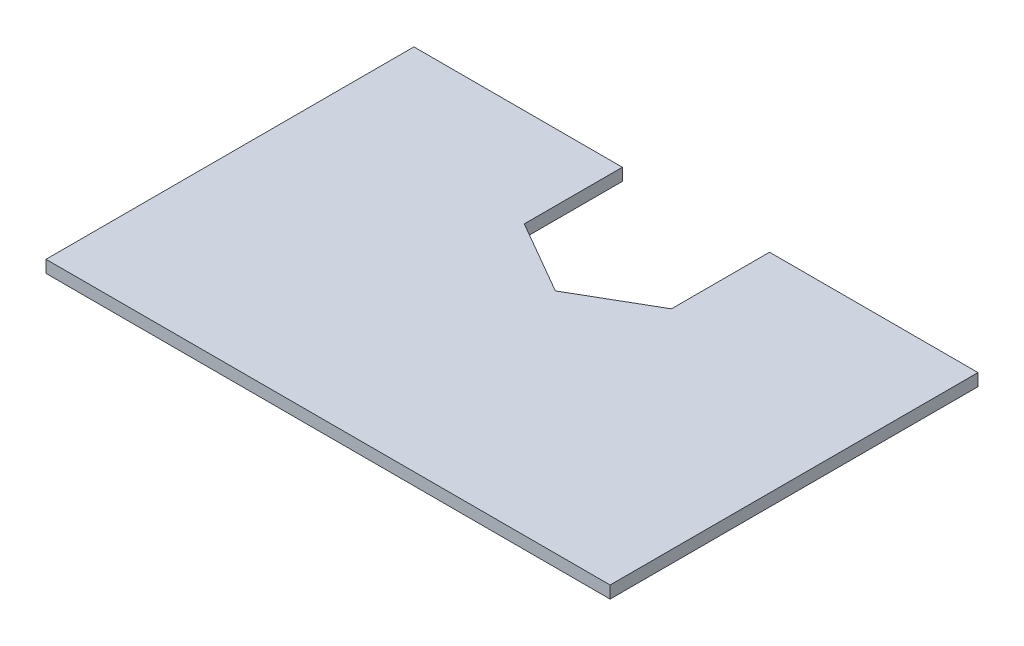
ISO-10303-21;
HEADER;
FILE_DESCRIPTION(('STEP AP214'),'2;1');
FILE_NAME('part.step','',(''),(''),'','','');
FILE_SCHEMA(('AUTOMOTIVE_DESIGN { 1 0 10303 214 1 1 1 1 }'));
ENDSEC;
DATA;
#1=APPLICATION_CONTEXT('core data for automotive mechanical design processes');
#2=APPLICATION_PROTOCOL_DEFINITION('international standard','automotive_design',2000,#1);
#3=PRODUCT_CONTEXT('',#1,'mechanical');
#4=PRODUCT('Part','Part','',(#3));
#5=PRODUCT_RELATED_PRODUCT_CATEGORY('part','',(#4));
#6=PRODUCT_DEFINITION_FORMATION('','',#4);
#7=PRODUCT_DEFINITION_CONTEXT('part definition',#1,'design');
#8=PRODUCT_DEFINITION('design','',#6,#7);
#9=PRODUCT_DEFINITION_SHAPE('','',#8);
#10=(LENGTH_UNIT() NAMED_UNIT(*) SI_UNIT(.MILLI.,.METRE.));
#11=(NAMED_UNIT(*) PLANE_ANGLE_UNIT() SI_UNIT($,.RADIAN.));
#12=(NAMED_UNIT(*) SI_UNIT($,.STERADIAN.) SOLID_ANGLE_UNIT());
#13=UNCERTAINTY_MEASURE_WITH_UNIT(LENGTH_MEASURE(1.E-05),#10,'distance_accuracy_value','');
#14=(GEOMETRIC_REPRESENTATION_CONTEXT(3) GLOBAL_UNCERTAINTY_ASSIGNED_CONTEXT((#13)) GLOBAL_UNIT_ASSIGNED_CONTEXT((#10,
#11,#12)) REPRESENTATION_CONTEXT('',''));
#15=CARTESIAN_POINT('',(0.,0.,0.));
#16=DIRECTION('',(0.,0.,1.));
#17=DIRECTION('',(1.,0.,0.));
#18=AXIS2_PLACEMENT_3D('',#15,#16,#17);
#19=CARTESIAN_POINT('',(0.,5.,0.));
#20=DIRECTION('',(0.,0.,1.));
#21=DIRECTION('',(1.,0.,0.));
#22=AXIS2_PLACEMENT_3D('',#19,#20,#21);
#23=PLANE('',#22);
#24=DIRECTION('',(-1.,0.,0.));
#25=VECTOR('',#24,1.);
#26=CARTESIAN_POINT('',(0.,5.,0.));
#27=LINE('',#26,#25);
#28=CARTESIAN_POINT('',(85.,5.,0.));
#29=VERTEX_POINT('',#28);
#30=CARTESIAN_POINT('',(0.,5.,0.));
#31=VERTEX_POINT('',#30);
#32=EDGE_CURVE('E60',#29,#31,#27,.T.);
#33=ORIENTED_EDGE('',*,*,#32,.F.);
#34=DIRECTION('',(0.,1.,0.));
#35=VECTOR('',#34,1.);
#36=CARTESIAN_POINT('',(85.,0.,0.));
#37=LINE('',#36,#35);
#38=CARTESIAN_POINT('',(85.,0.,0.));
#39=VERTEX_POINT('',#38);
#40=EDGE_CURVE('E148',#39,#29,#37,.T.);
#41=ORIENTED_EDGE('',*,*,#40,.F.);
#42=DIRECTION('',(-1.,0.,0.));
#43=VECTOR('',#42,1.);
#44=CARTESIAN_POINT('',(0.,0.,0.));
#45=LINE('',#44,#43);
#46=CARTESIAN_POINT('',(0.,0.,0.));
#47=VERTEX_POINT('',#46);
#48=EDGE_CURVE('E82',#39,#47,#45,.T.);
#49=ORIENTED_EDGE('',*,*,#48,.T.);
#50=DIRECTION('',(0.,-1.,0.));
#51=VECTOR('',#50,1.);
#52=CARTESIAN_POINT('',(0.,5.,0.));
#53=LINE('',#52,#51);
#54=EDGE_CURVE('E166',#31,#47,#53,.T.);
#55=ORIENTED_EDGE('',*,*,#54,.F.);
#56=EDGE_LOOP('',(#33,#41,#49,#55));
#57=FACE_BOUND('',#56,.T.);
#58=ADVANCED_FACE('F36',(#57),#23,.F.);
#59=CARTESIAN_POINT('',(0.,5.,150.));
#60=DIRECTION('',(1.,0.,0.));
#61=DIRECTION('',(0.,0.,-1.));
#62=AXIS2_PLACEMENT_3D('',#59,#60,#61);
#63=PLANE('',#62);
#64=DIRECTION('',(0.,0.,1.));
#65=VECTOR('',#64,1.);
#66=CARTESIAN_POINT('',(0.,0.,150.));
#67=LINE('',#66,#65);
#68=CARTESIAN_POINT('',(0.,0.,150.));
#69=VERTEX_POINT('',#68);
#70=EDGE_CURVE('E150',#47,#69,#67,.T.);
#71=ORIENTED_EDGE('',*,*,#70,.T.);
#72=DIRECTION('',(0.,-1.,0.));
#73=VECTOR('',#72,1.);
#74=CARTESIAN_POINT('',(0.,5.,150.));
#75=LINE('',#74,#73);
#76=CARTESIAN_POINT('',(0.,5.,150.));
#77=VERTEX_POINT('',#76);
#78=EDGE_CURVE('E11',#77,#69,#75,.T.);
#79=ORIENTED_EDGE('',*,*,#78,.F.);
#80=DIRECTION('',(0.,0.,1.));
#81=VECTOR('',#80,1.);
#82=CARTESIAN_POINT('',(0.,5.,150.));
#83=LINE('',#82,#81);
#84=EDGE_CURVE('E157',#31,#77,#83,.T.);
#85=ORIENTED_EDGE('',*,*,#84,.F.);
#86=ORIENTED_EDGE('',*,*,#54,.T.);
#87=EDGE_LOOP('',(#71,#79,#85,#86));
#88=FACE_BOUND('',#87,.T.);
#89=ADVANCED_FACE('F38',(#88),#63,.F.);
#90=CARTESIAN_POINT('',(230.,5.,150.));
#91=DIRECTION('',(0.,0.,-1.));
#92=DIRECTION('',(-1.,0.,0.));
#93=AXIS2_PLACEMENT_3D('',#90,#91,#92);
#94=PLANE('',#93);
#95=DIRECTION('',(1.,0.,0.));
#96=VECTOR('',#95,1.);
#97=CARTESIAN_POINT('',(230.,0.,150.));
#98=LINE('',#97,#96);
#99=CARTESIAN_POINT('',(230.,0.,150.));
#100=VERTEX_POINT('',#99);
#101=EDGE_CURVE('E169',#69,#100,#98,.T.);
#102=ORIENTED_EDGE('',*,*,#101,.T.);
#103=DIRECTION('',(0.,-1.,0.));
#104=VECTOR('',#103,1.);
#105=CARTESIAN_POINT('',(230.,5.,150.));
#106=LINE('',#105,#104);
#107=CARTESIAN_POINT('',(230.,5.,150.));
#108=VERTEX_POINT('',#107);
#109=EDGE_CURVE('E44',#108,#100,#106,.T.);
#110=ORIENTED_EDGE('',*,*,#109,.F.);
#111=DIRECTION('',(1.,0.,0.));
#112=VECTOR('',#111,1.);
#113=CARTESIAN_POINT('',(230.,5.,150.));
#114=LINE('',#113,#112);
#115=EDGE_CURVE('E89',#77,#108,#114,.T.);
#116=ORIENTED_EDGE('',*,*,#115,.F.);
#117=ORIENTED_EDGE('',*,*,#78,.T.);
#118=EDGE_LOOP('',(#102,#110,#116,#117));
#119=FACE_BOUND('',#118,.T.);
#120=ADVANCED_FACE('F195',(#119),#94,.F.);
#121=CARTESIAN_POINT('',(230.,5.,0.));
#122=DIRECTION('',(-1.,0.,0.));
#123=DIRECTION('',(0.,0.,1.));
#124=AXIS2_PLACEMENT_3D('',#121,#122,#123);
#125=PLANE('',#124);
#126=DIRECTION('',(0.,0.,-1.));
#127=VECTOR('',#126,1.);
#128=CARTESIAN_POINT('',(230.,0.,0.));
#129=LINE('',#128,#127);
#130=CARTESIAN_POINT('',(230.,0.,0.));
#131=VERTEX_POINT('',#130);
#132=EDGE_CURVE('E171',#100,#131,#129,.T.);
#133=ORIENTED_EDGE('',*,*,#132,.T.);
#134=DIRECTION('',(0.,-1.,0.));
#135=VECTOR('',#134,1.);
#136=CARTESIAN_POINT('',(230.,5.,0.));
#137=LINE('',#136,#135);
#138=CARTESIAN_POINT('',(230.,5.,0.));
#139=VERTEX_POINT('',#138);
#140=EDGE_CURVE('E176',#139,#131,#137,.T.);
#141=ORIENTED_EDGE('',*,*,#140,.F.);
#142=DIRECTION('',(0.,0.,-1.));
#143=VECTOR('',#142,1.);
#144=CARTESIAN_POINT('',(230.,5.,0.));
#145=LINE('',#144,#143);
#146=EDGE_CURVE('E161',#108,#139,#145,.T.);
#147=ORIENTED_EDGE('',*,*,#146,.F.);
#148=ORIENTED_EDGE('',*,*,#109,.T.);
#149=EDGE_LOOP('',(#133,#141,#147,#148));
#150=FACE_BOUND('',#149,.T.);
#151=ADVANCED_FACE('F182',(#150),#125,.F.);
#152=CARTESIAN_POINT('',(145.,0.,0.));
#153=VERTEX_POINT('',#152);
#154=EDGE_CURVE('E159',#131,#153,#45,.T.);
#155=ORIENTED_EDGE('',*,*,#154,.T.);
#156=DIRECTION('',(0.,1.,0.));
#157=VECTOR('',#156,1.);
#158=CARTESIAN_POINT('',(145.,0.,0.));
#159=LINE('',#158,#157);
#160=CARTESIAN_POINT('',(145.,5.,0.));
#161=VERTEX_POINT('',#160);
#162=EDGE_CURVE('E151',#153,#161,#159,.T.);
#163=ORIENTED_EDGE('',*,*,#162,.T.);
#164=EDGE_CURVE('E163',#139,#161,#27,.T.);
#165=ORIENTED_EDGE('',*,*,#164,.F.);
#166=ORIENTED_EDGE('',*,*,#140,.T.);
#167=EDGE_LOOP('',(#155,#163,#165,#166));
#168=FACE_BOUND('',#167,.T.);
#169=ADVANCED_FACE('F187',(#168),#23,.F.);
#170=CARTESIAN_POINT('',(0.,5.,0.));
#171=DIRECTION('',(0.,-1.,0.));
#172=DIRECTION('',(0.,0.,-1.));
#173=AXIS2_PLACEMENT_3D('',#170,#171,#172);
#174=PLANE('',#173);
#175=DIRECTION('',(0.86602540378444,0.,0.499999999999998));
#176=VECTOR('',#175,1.);
#177=CARTESIAN_POINT('',(85.,5.,40.));
#178=LINE('',#177,#176);
#179=CARTESIAN_POINT('',(85.,5.,40.));
#180=VERTEX_POINT('',#179);
#181=CARTESIAN_POINT('',(115.,5.,57.3205080756887));
#182=VERTEX_POINT('',#181);
#183=EDGE_CURVE('E144',#180,#182,#178,.T.);
#184=ORIENTED_EDGE('',*,*,#183,.F.);
#185=DIRECTION('',(0.,0.,1.));
#186=VECTOR('',#185,1.);
#187=CARTESIAN_POINT('',(85.,5.,0.));
#188=LINE('',#187,#186);
#189=EDGE_CURVE('E121',#29,#180,#188,.T.);
#190=ORIENTED_EDGE('',*,*,#189,.F.);
#191=ORIENTED_EDGE('',*,*,#32,.T.);
#192=ORIENTED_EDGE('',*,*,#84,.T.);
#193=ORIENTED_EDGE('',*,*,#115,.T.);
#194=ORIENTED_EDGE('',*,*,#146,.T.);
#195=ORIENTED_EDGE('',*,*,#164,.T.);
#196=DIRECTION('',(0.,0.,-1.));
#197=VECTOR('',#196,1.);
#198=CARTESIAN_POINT('',(145.,5.,0.));
#199=LINE('',#198,#197);
#200=CARTESIAN_POINT('',(145.,5.,40.));
#201=VERTEX_POINT('',#200);
#202=EDGE_CURVE('E135',#201,#161,#199,.T.);
#203=ORIENTED_EDGE('',*,*,#202,.F.);
#204=DIRECTION('',(0.86602540378444,0.,-0.499999999999998));
#205=VECTOR('',#204,1.);
#206=CARTESIAN_POINT('',(145.,5.,40.));
#207=LINE('',#206,#205);
#208=EDGE_CURVE('E137',#182,#201,#207,.T.);
#209=ORIENTED_EDGE('',*,*,#208,.F.);
#210=EDGE_LOOP('',(#184,#190,#191,#192,#193,#194,#195,#203,#209));
#211=FACE_BOUND('',#210,.T.);
#212=ADVANCED_FACE('F190',(#211),#174,.F.);
#213=CARTESIAN_POINT('',(0.,0.,0.));
#214=DIRECTION('',(0.,-1.,0.));
#215=DIRECTION('',(0.,0.,-1.));
#216=AXIS2_PLACEMENT_3D('',#213,#214,#215);
#217=PLANE('',#216);
#218=DIRECTION('',(0.,0.,1.));
#219=VECTOR('',#218,1.);
#220=CARTESIAN_POINT('',(85.,0.,0.));
#221=LINE('',#220,#219);
#222=CARTESIAN_POINT('',(85.,0.,40.));
#223=VERTEX_POINT('',#222);
#224=EDGE_CURVE('E120',#39,#223,#221,.T.);
#225=ORIENTED_EDGE('',*,*,#224,.T.);
#226=DIRECTION('',(0.86602540378444,0.,0.499999999999998));
#227=VECTOR('',#226,1.);
#228=CARTESIAN_POINT('',(85.,0.,40.));
#229=LINE('',#228,#227);
#230=CARTESIAN_POINT('',(115.,0.,57.3205080756887));
#231=VERTEX_POINT('',#230);
#232=EDGE_CURVE('E129',#223,#231,#229,.T.);
#233=ORIENTED_EDGE('',*,*,#232,.T.);
#234=DIRECTION('',(0.86602540378444,0.,-0.499999999999998));
#235=VECTOR('',#234,1.);
#236=CARTESIAN_POINT('',(145.,0.,40.));
#237=LINE('',#236,#235);
#238=CARTESIAN_POINT('',(145.,0.,40.));
#239=VERTEX_POINT('',#238);
#240=EDGE_CURVE('E51',#231,#239,#237,.T.);
#241=ORIENTED_EDGE('',*,*,#240,.T.);
#242=DIRECTION('',(0.,0.,-1.));
#243=VECTOR('',#242,1.);
#244=CARTESIAN_POINT('',(145.,0.,0.));
#245=LINE('',#244,#243);
#246=EDGE_CURVE('E126',#239,#153,#245,.T.);
#247=ORIENTED_EDGE('',*,*,#246,.T.);
#248=ORIENTED_EDGE('',*,*,#154,.F.);
#249=ORIENTED_EDGE('',*,*,#132,.F.);
#250=ORIENTED_EDGE('',*,*,#101,.F.);
#251=ORIENTED_EDGE('',*,*,#70,.F.);
#252=ORIENTED_EDGE('',*,*,#48,.F.);
#253=EDGE_LOOP('',(#225,#233,#241,#247,#248,#249,#250,#251,#252));
#254=FACE_BOUND('',#253,.T.);
#255=ADVANCED_FACE('F133',(#254),#217,.T.);
#256=CARTESIAN_POINT('',(85.,0.,0.));
#257=DIRECTION('',(-1.,0.,0.));
#258=DIRECTION('',(0.,0.,1.));
#259=AXIS2_PLACEMENT_3D('',#256,#257,#258);
#260=PLANE('',#259);
#261=ORIENTED_EDGE('',*,*,#189,.T.);
#262=DIRECTION('',(0.,1.,0.));
#263=VECTOR('',#262,1.);
#264=CARTESIAN_POINT('',(85.,0.,40.));
#265=LINE('',#264,#263);
#266=EDGE_CURVE('E116',#223,#180,#265,.T.);
#267=ORIENTED_EDGE('',*,*,#266,.F.);
#268=ORIENTED_EDGE('',*,*,#224,.F.);
#269=ORIENTED_EDGE('',*,*,#40,.T.);
#270=EDGE_LOOP('',(#261,#267,#268,#269));
#271=FACE_BOUND('',#270,.T.);
#272=ADVANCED_FACE('F118',(#271),#260,.F.);
#273=CARTESIAN_POINT('',(145.,0.,0.));
#274=DIRECTION('',(1.,0.,0.));
#275=DIRECTION('',(0.,0.,-1.));
#276=AXIS2_PLACEMENT_3D('',#273,#274,#275);
#277=PLANE('',#276);
#278=ORIENTED_EDGE('',*,*,#202,.T.);
#279=ORIENTED_EDGE('',*,*,#162,.F.);
#280=ORIENTED_EDGE('',*,*,#246,.F.);
#281=DIRECTION('',(0.,1.,0.));
#282=VECTOR('',#281,1.);
#283=CARTESIAN_POINT('',(145.,0.,40.));
#284=LINE('',#283,#282);
#285=EDGE_CURVE('E154',#239,#201,#284,.T.);
#286=ORIENTED_EDGE('',*,*,#285,.T.);
#287=EDGE_LOOP('',(#278,#279,#280,#286));
#288=FACE_BOUND('',#287,.T.);
#289=ADVANCED_FACE('F218',(#288),#277,.F.);
#290=CARTESIAN_POINT('',(145.,0.,40.));
#291=DIRECTION('',(0.499999999999998,0.,0.86602540378444));
#292=DIRECTION('',(0.86602540378444,0.,-0.499999999999998));
#293=AXIS2_PLACEMENT_3D('',#290,#291,#292);
#294=PLANE('',#293);
#295=ORIENTED_EDGE('',*,*,#208,.T.);
#296=ORIENTED_EDGE('',*,*,#285,.F.);
#297=ORIENTED_EDGE('',*,*,#240,.F.);
#298=DIRECTION('',(0.,1.,0.));
#299=VECTOR('',#298,1.);
#300=CARTESIAN_POINT('',(115.,0.,57.3205080756887));
#301=LINE('',#300,#299);
#302=EDGE_CURVE('E125',#231,#182,#301,.T.);
#303=ORIENTED_EDGE('',*,*,#302,.T.);
#304=EDGE_LOOP('',(#295,#296,#297,#303));
#305=FACE_BOUND('',#304,.T.);
#306=ADVANCED_FACE('F221',(#305),#294,.F.);
#307=CARTESIAN_POINT('',(85.,0.,40.));
#308=DIRECTION('',(-0.499999999999998,0.,0.86602540378444));
#309=DIRECTION('',(0.86602540378444,0.,0.499999999999998));
#310=AXIS2_PLACEMENT_3D('',#307,#308,#309);
#311=PLANE('',#310);
#312=ORIENTED_EDGE('',*,*,#183,.T.);
#313=ORIENTED_EDGE('',*,*,#302,.F.);
#314=ORIENTED_EDGE('',*,*,#232,.F.);
#315=ORIENTED_EDGE('',*,*,#266,.T.);
#316=EDGE_LOOP('',(#312,#313,#314,#315));
#317=FACE_BOUND('',#316,.T.);
#318=ADVANCED_FACE('F130',(#317),#311,.F.);
#319=CLOSED_SHELL('',(#58,#89,#120,#151,#169,#212,#255,#272,#289,#306,#318));
#320=MANIFOLD_SOLID_BREP('B2',#319);
#321=ADVANCED_BREP_SHAPE_REPRESENTATION('',(#18,#320),#14);
#322=SHAPE_DEFINITION_REPRESENTATION(#9,#321);
ENDSEC;
END-ISO-10303-21;
